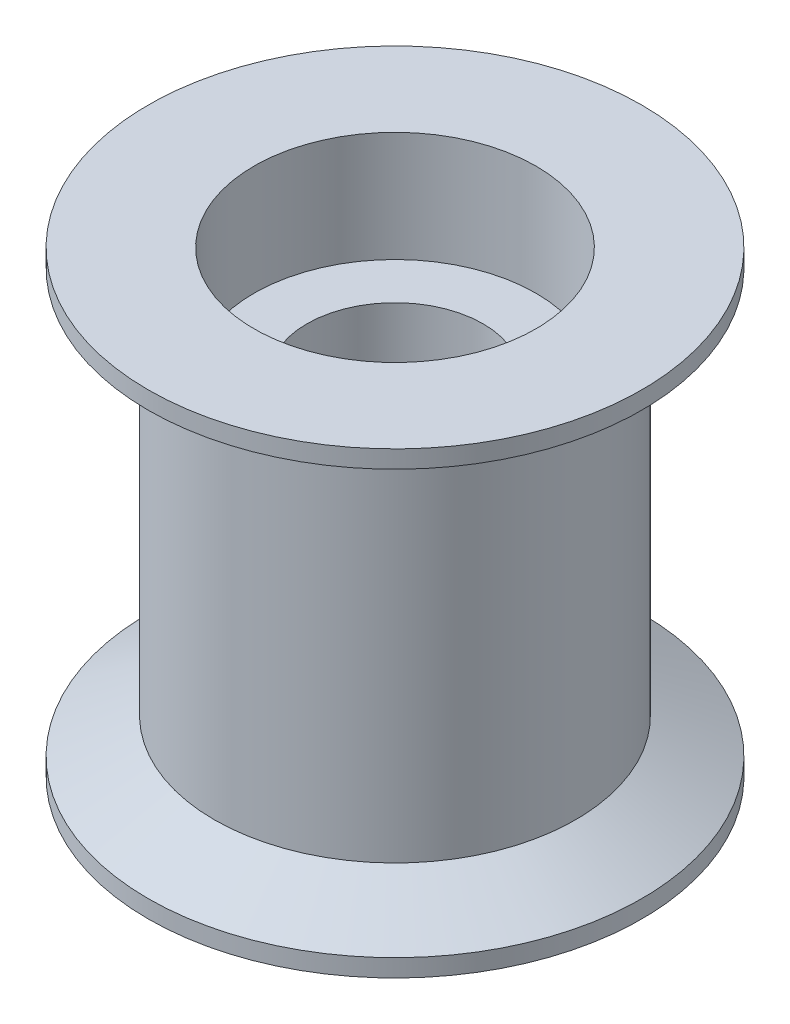
ISO-10303-21;
HEADER;
FILE_DESCRIPTION(('STEP AP214'),'2;1');
FILE_NAME('part.step','',(''),(''),'','','');
FILE_SCHEMA(('AUTOMOTIVE_DESIGN { 1 0 10303 214 1 1 1 1 }'));
ENDSEC;
DATA;
#1=APPLICATION_CONTEXT('core data for automotive mechanical design processes');
#2=APPLICATION_PROTOCOL_DEFINITION('international standard','automotive_design',2000,#1);
#3=PRODUCT_CONTEXT('',#1,'mechanical');
#4=PRODUCT('Part','Part','',(#3));
#5=PRODUCT_RELATED_PRODUCT_CATEGORY('part','',(#4));
#6=PRODUCT_DEFINITION_FORMATION('','',#4);
#7=PRODUCT_DEFINITION_CONTEXT('part definition',#1,'design');
#8=PRODUCT_DEFINITION('design','',#6,#7);
#9=PRODUCT_DEFINITION_SHAPE('','',#8);
#10=(LENGTH_UNIT() NAMED_UNIT(*) SI_UNIT(.MILLI.,.METRE.));
#11=(NAMED_UNIT(*) PLANE_ANGLE_UNIT() SI_UNIT($,.RADIAN.));
#12=(NAMED_UNIT(*) SI_UNIT($,.STERADIAN.) SOLID_ANGLE_UNIT());
#13=UNCERTAINTY_MEASURE_WITH_UNIT(LENGTH_MEASURE(1.E-05),#10,'distance_accuracy_value','');
#14=(GEOMETRIC_REPRESENTATION_CONTEXT(3) GLOBAL_UNCERTAINTY_ASSIGNED_CONTEXT((#13)) GLOBAL_UNIT_ASSIGNED_CONTEXT((#10,
#11,#12)) REPRESENTATION_CONTEXT('',''));
#15=CARTESIAN_POINT('',(0.,0.,0.));
#16=DIRECTION('',(0.,0.,1.));
#17=DIRECTION('',(1.,0.,0.));
#18=AXIS2_PLACEMENT_3D('',#15,#16,#17);
#19=CARTESIAN_POINT('',(0.,0.,0.));
#20=DIRECTION('',(0.,-1.,0.));
#21=DIRECTION('',(0.,0.,-1.));
#22=AXIS2_PLACEMENT_3D('',#19,#20,#21);
#23=CYLINDRICAL_SURFACE('',#22,2.50000000000051);
#24=CARTESIAN_POINT('',(0.,3.375,0.));
#25=DIRECTION('',(0.,-1.,0.));
#26=DIRECTION('',(0.,0.,-1.));
#27=AXIS2_PLACEMENT_3D('',#24,#25,#26);
#28=CIRCLE('',#27,2.5);
#29=CARTESIAN_POINT('',(0.,3.375,-2.5));
#30=VERTEX_POINT('',#29);
#31=EDGE_CURVE('E10',#30,#30,#28,.T.);
#32=ORIENTED_EDGE('',*,*,#31,.F.);
#33=EDGE_LOOP('',(#32));
#34=FACE_BOUND('',#33,.T.);
#35=CARTESIAN_POINT('',(0.,-3.375,0.));
#36=DIRECTION('',(0.,-1.,0.));
#37=DIRECTION('',(0.,0.,-1.));
#38=AXIS2_PLACEMENT_3D('',#35,#36,#37);
#39=CIRCLE('',#38,2.5);
#40=CARTESIAN_POINT('',(0.,-3.375,-2.5));
#41=VERTEX_POINT('',#40);
#42=EDGE_CURVE('E62',#41,#41,#39,.T.);
#43=ORIENTED_EDGE('',*,*,#42,.T.);
#44=EDGE_LOOP('',(#43));
#45=FACE_BOUND('',#44,.T.);
#46=ADVANCED_FACE('F37',(#34,#45),#23,.F.);
#47=CARTESIAN_POINT('',(0.,3.375,-2.5));
#48=DIRECTION('',(0.,1.,0.));
#49=DIRECTION('',(0.,0.,1.));
#50=AXIS2_PLACEMENT_3D('',#47,#48,#49);
#51=PLANE('',#50);
#52=ORIENTED_EDGE('',*,*,#31,.T.);
#53=EDGE_LOOP('',(#52));
#54=FACE_BOUND('',#53,.T.);
#55=CARTESIAN_POINT('',(0.,3.375,0.));
#56=DIRECTION('',(0.,-1.,0.));
#57=DIRECTION('',(0.,0.,-1.));
#58=AXIS2_PLACEMENT_3D('',#55,#56,#57);
#59=CIRCLE('',#58,4.);
#60=CARTESIAN_POINT('',(0.,3.375,-4.));
#61=VERTEX_POINT('',#60);
#62=EDGE_CURVE('E43',#61,#61,#59,.T.);
#63=ORIENTED_EDGE('',*,*,#62,.F.);
#64=EDGE_LOOP('',(#63));
#65=FACE_BOUND('',#64,.T.);
#66=ADVANCED_FACE('F100',(#54,#65),#51,.T.);
#67=CARTESIAN_POINT('',(0.,0.,0.));
#68=DIRECTION('',(0.,-1.,0.));
#69=DIRECTION('',(0.,0.,-1.));
#70=AXIS2_PLACEMENT_3D('',#67,#68,#69);
#71=CYLINDRICAL_SURFACE('',#70,4.);
#72=ORIENTED_EDGE('',*,*,#62,.T.);
#73=EDGE_LOOP('',(#72));
#74=FACE_BOUND('',#73,.T.);
#75=CARTESIAN_POINT('',(0.,6.5,0.));
#76=DIRECTION('',(0.,-1.,0.));
#77=DIRECTION('',(0.,0.,-1.));
#78=AXIS2_PLACEMENT_3D('',#75,#76,#77);
#79=CIRCLE('',#78,4.);
#80=CARTESIAN_POINT('',(0.,6.5,-4.));
#81=VERTEX_POINT('',#80);
#82=EDGE_CURVE('E47',#81,#81,#79,.T.);
#83=ORIENTED_EDGE('',*,*,#82,.F.);
#84=EDGE_LOOP('',(#83));
#85=FACE_BOUND('',#84,.T.);
#86=ADVANCED_FACE('F105',(#74,#85),#71,.F.);
#87=CARTESIAN_POINT('',(0.,6.5,-4.));
#88=DIRECTION('',(0.,1.,0.));
#89=DIRECTION('',(0.,0.,1.));
#90=AXIS2_PLACEMENT_3D('',#87,#88,#89);
#91=PLANE('',#90);
#92=ORIENTED_EDGE('',*,*,#82,.T.);
#93=EDGE_LOOP('',(#92));
#94=FACE_BOUND('',#93,.T.);
#95=CARTESIAN_POINT('',(0.,6.5,0.));
#96=DIRECTION('',(0.,-1.,0.));
#97=DIRECTION('',(0.,0.,-1.));
#98=AXIS2_PLACEMENT_3D('',#95,#96,#97);
#99=CIRCLE('',#98,7.);
#100=CARTESIAN_POINT('',(0.,6.5,-7.));
#101=VERTEX_POINT('',#100);
#102=EDGE_CURVE('E51',#101,#101,#99,.T.);
#103=ORIENTED_EDGE('',*,*,#102,.F.);
#104=EDGE_LOOP('',(#103));
#105=FACE_BOUND('',#104,.T.);
#106=ADVANCED_FACE('F175',(#94,#105),#91,.T.);
#107=CARTESIAN_POINT('',(0.,0.,0.));
#108=DIRECTION('',(0.,-1.,0.));
#109=DIRECTION('',(0.,0.,-1.));
#110=AXIS2_PLACEMENT_3D('',#107,#108,#109);
#111=CYLINDRICAL_SURFACE('',#110,7.);
#112=ORIENTED_EDGE('',*,*,#102,.T.);
#113=EDGE_LOOP('',(#112));
#114=FACE_BOUND('',#113,.T.);
#115=CARTESIAN_POINT('',(0.,6.,0.));
#116=DIRECTION('',(0.,-1.,0.));
#117=DIRECTION('',(0.,0.,-1.));
#118=AXIS2_PLACEMENT_3D('',#115,#116,#117);
#119=CIRCLE('',#118,7.);
#120=CARTESIAN_POINT('',(0.,6.,-7.));
#121=VERTEX_POINT('',#120);
#122=EDGE_CURVE('E56',#121,#121,#119,.T.);
#123=ORIENTED_EDGE('',*,*,#122,.F.);
#124=EDGE_LOOP('',(#123));
#125=FACE_BOUND('',#124,.T.);
#126=ADVANCED_FACE('F96',(#114,#125),#111,.T.);
#127=CARTESIAN_POINT('',(0.,5.,0.));
#128=DIRECTION('',(0.,1.,0.));
#129=DIRECTION('',(0.,0.,1.));
#130=AXIS2_PLACEMENT_3D('',#127,#128,#129);
#131=CONICAL_SURFACE('',#130,5.125,1.08083900054117);
#132=ORIENTED_EDGE('',*,*,#122,.T.);
#133=EDGE_LOOP('',(#132));
#134=FACE_BOUND('',#133,.T.);
#135=CARTESIAN_POINT('',(0.,5.,0.));
#136=DIRECTION('',(0.,-1.,0.));
#137=DIRECTION('',(0.,0.,-1.));
#138=AXIS2_PLACEMENT_3D('',#135,#136,#137);
#139=CIRCLE('',#138,5.125);
#140=CARTESIAN_POINT('',(0.,5.,-5.125));
#141=VERTEX_POINT('',#140);
#142=EDGE_CURVE('E59',#141,#141,#139,.T.);
#143=ORIENTED_EDGE('',*,*,#142,.F.);
#144=EDGE_LOOP('',(#143));
#145=FACE_BOUND('',#144,.T.);
#146=ADVANCED_FACE('F86',(#134,#145),#131,.T.);
#147=CARTESIAN_POINT('',(0.,0.,0.));
#148=DIRECTION('',(0.,-1.,0.));
#149=DIRECTION('',(0.,0.,-1.));
#150=AXIS2_PLACEMENT_3D('',#147,#148,#149);
#151=CYLINDRICAL_SURFACE('',#150,5.125);
#152=ORIENTED_EDGE('',*,*,#142,.T.);
#153=EDGE_LOOP('',(#152));
#154=FACE_BOUND('',#153,.T.);
#155=CARTESIAN_POINT('',(0.,-5.,0.));
#156=DIRECTION('',(0.,-1.,0.));
#157=DIRECTION('',(0.,0.,-1.));
#158=AXIS2_PLACEMENT_3D('',#155,#156,#157);
#159=CIRCLE('',#158,5.125);
#160=CARTESIAN_POINT('',(0.,-5.,-5.125));
#161=VERTEX_POINT('',#160);
#162=EDGE_CURVE('E77',#161,#161,#159,.T.);
#163=ORIENTED_EDGE('',*,*,#162,.F.);
#164=EDGE_LOOP('',(#163));
#165=FACE_BOUND('',#164,.T.);
#166=ADVANCED_FACE('F83',(#154,#165),#151,.T.);
#167=CARTESIAN_POINT('',(0.,-3.375,-2.5));
#168=DIRECTION('',(0.,-1.,0.));
#169=DIRECTION('',(0.,0.,1.));
#170=AXIS2_PLACEMENT_3D('',#167,#168,#169);
#171=PLANE('',#170);
#172=ORIENTED_EDGE('',*,*,#42,.F.);
#173=EDGE_LOOP('',(#172));
#174=FACE_BOUND('',#173,.T.);
#175=CARTESIAN_POINT('',(0.,-3.375,0.));
#176=DIRECTION('',(0.,-1.,0.));
#177=DIRECTION('',(0.,0.,-1.));
#178=AXIS2_PLACEMENT_3D('',#175,#176,#177);
#179=CIRCLE('',#178,4.);
#180=CARTESIAN_POINT('',(0.,-3.375,-4.));
#181=VERTEX_POINT('',#180);
#182=EDGE_CURVE('E65',#181,#181,#179,.T.);
#183=ORIENTED_EDGE('',*,*,#182,.T.);
#184=EDGE_LOOP('',(#183));
#185=FACE_BOUND('',#184,.T.);
#186=ADVANCED_FACE('F85',(#174,#185),#171,.T.);
#187=CARTESIAN_POINT('',(0.,0.,0.));
#188=DIRECTION('',(0.,1.,0.));
#189=DIRECTION('',(0.,0.,-1.));
#190=AXIS2_PLACEMENT_3D('',#187,#188,#189);
#191=CYLINDRICAL_SURFACE('',#190,4.);
#192=ORIENTED_EDGE('',*,*,#182,.F.);
#193=EDGE_LOOP('',(#192));
#194=FACE_BOUND('',#193,.T.);
#195=CARTESIAN_POINT('',(0.,-6.5,0.));
#196=DIRECTION('',(0.,-1.,0.));
#197=DIRECTION('',(0.,0.,-1.));
#198=AXIS2_PLACEMENT_3D('',#195,#196,#197);
#199=CIRCLE('',#198,4.);
#200=CARTESIAN_POINT('',(0.,-6.5,-4.));
#201=VERTEX_POINT('',#200);
#202=EDGE_CURVE('E68',#201,#201,#199,.T.);
#203=ORIENTED_EDGE('',*,*,#202,.T.);
#204=EDGE_LOOP('',(#203));
#205=FACE_BOUND('',#204,.T.);
#206=ADVANCED_FACE('F93',(#194,#205),#191,.F.);
#207=CARTESIAN_POINT('',(0.,-6.5,-4.));
#208=DIRECTION('',(0.,-1.,0.));
#209=DIRECTION('',(0.,0.,1.));
#210=AXIS2_PLACEMENT_3D('',#207,#208,#209);
#211=PLANE('',#210);
#212=ORIENTED_EDGE('',*,*,#202,.F.);
#213=EDGE_LOOP('',(#212));
#214=FACE_BOUND('',#213,.T.);
#215=CARTESIAN_POINT('',(0.,-6.5,0.));
#216=DIRECTION('',(0.,-1.,0.));
#217=DIRECTION('',(0.,0.,-1.));
#218=AXIS2_PLACEMENT_3D('',#215,#216,#217);
#219=CIRCLE('',#218,7.);
#220=CARTESIAN_POINT('',(0.,-6.5,-7.));
#221=VERTEX_POINT('',#220);
#222=EDGE_CURVE('E71',#221,#221,#219,.T.);
#223=ORIENTED_EDGE('',*,*,#222,.T.);
#224=EDGE_LOOP('',(#223));
#225=FACE_BOUND('',#224,.T.);
#226=ADVANCED_FACE('F113',(#214,#225),#211,.T.);
#227=CARTESIAN_POINT('',(0.,0.,0.));
#228=DIRECTION('',(0.,1.,0.));
#229=DIRECTION('',(0.,0.,-1.));
#230=AXIS2_PLACEMENT_3D('',#227,#228,#229);
#231=CYLINDRICAL_SURFACE('',#230,7.);
#232=ORIENTED_EDGE('',*,*,#222,.F.);
#233=EDGE_LOOP('',(#232));
#234=FACE_BOUND('',#233,.T.);
#235=CARTESIAN_POINT('',(0.,-6.,0.));
#236=DIRECTION('',(0.,-1.,0.));
#237=DIRECTION('',(0.,0.,-1.));
#238=AXIS2_PLACEMENT_3D('',#235,#236,#237);
#239=CIRCLE('',#238,7.);
#240=CARTESIAN_POINT('',(0.,-6.,-7.));
#241=VERTEX_POINT('',#240);
#242=EDGE_CURVE('E74',#241,#241,#239,.T.);
#243=ORIENTED_EDGE('',*,*,#242,.T.);
#244=EDGE_LOOP('',(#243));
#245=FACE_BOUND('',#244,.T.);
#246=ADVANCED_FACE('F119',(#234,#245),#231,.T.);
#247=CARTESIAN_POINT('',(0.,-5.,0.));
#248=DIRECTION('',(0.,-1.,0.));
#249=DIRECTION('',(0.,0.,1.));
#250=AXIS2_PLACEMENT_3D('',#247,#248,#249);
#251=CONICAL_SURFACE('',#250,5.125,1.08083900054117);
#252=ORIENTED_EDGE('',*,*,#242,.F.);
#253=EDGE_LOOP('',(#252));
#254=FACE_BOUND('',#253,.T.);
#255=ORIENTED_EDGE('',*,*,#162,.T.);
#256=EDGE_LOOP('',(#255));
#257=FACE_BOUND('',#256,.T.);
#258=ADVANCED_FACE('F81',(#254,#257),#251,.T.);
#259=CLOSED_SHELL('',(#46,#66,#86,#106,#126,#146,#166,#186,#206,#226,#246,#258));
#260=MANIFOLD_SOLID_BREP('B2',#259);
#261=ADVANCED_BREP_SHAPE_REPRESENTATION('',(#18,#260),#14);
#262=SHAPE_DEFINITION_REPRESENTATION(#9,#261);
ENDSEC;
END-ISO-10303-21;
